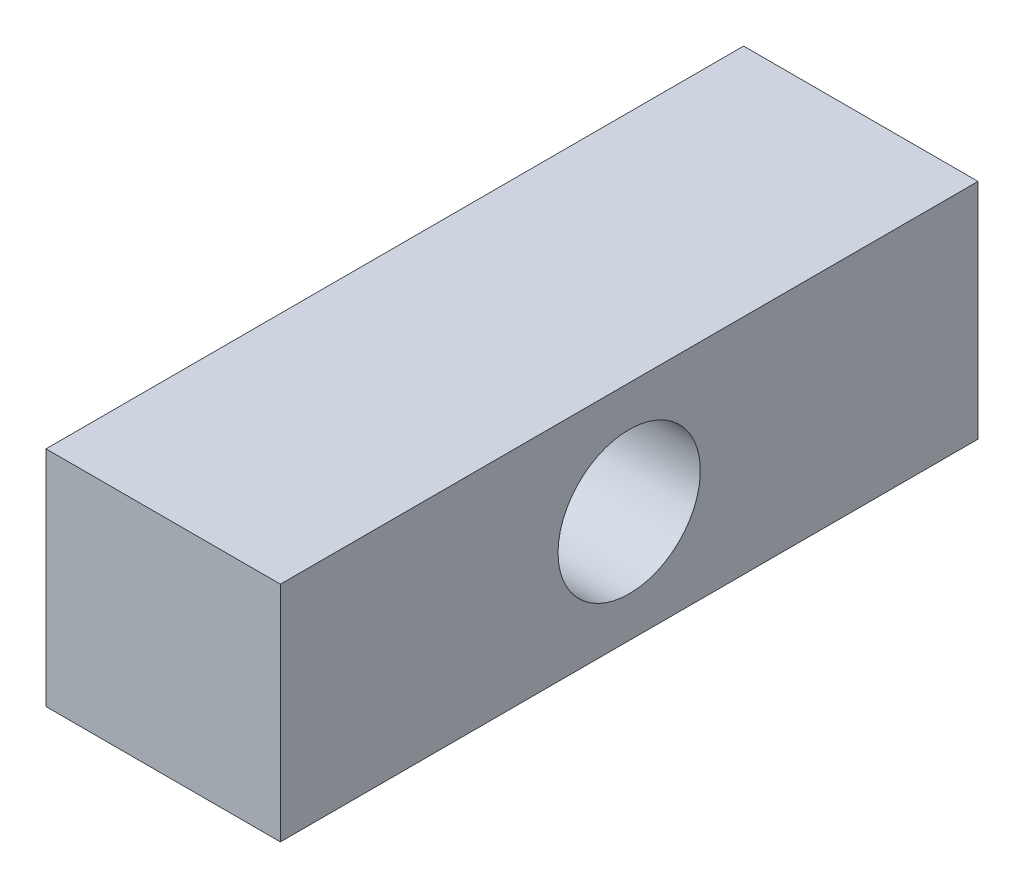
ISO-10303-21;
HEADER;
FILE_DESCRIPTION(('STEP AP214'),'2;1');
FILE_NAME('part.step','',(''),(''),'','','');
FILE_SCHEMA(('AUTOMOTIVE_DESIGN { 1 0 10303 214 1 1 1 1 }'));
ENDSEC;
DATA;
#1=APPLICATION_CONTEXT('core data for automotive mechanical design processes');
#2=APPLICATION_PROTOCOL_DEFINITION('international standard','automotive_design',2000,#1);
#3=PRODUCT_CONTEXT('',#1,'mechanical');
#4=PRODUCT('Part','Part','',(#3));
#5=PRODUCT_RELATED_PRODUCT_CATEGORY('part','',(#4));
#6=PRODUCT_DEFINITION_FORMATION('','',#4);
#7=PRODUCT_DEFINITION_CONTEXT('part definition',#1,'design');
#8=PRODUCT_DEFINITION('design','',#6,#7);
#9=PRODUCT_DEFINITION_SHAPE('','',#8);
#10=(LENGTH_UNIT() NAMED_UNIT(*) SI_UNIT(.MILLI.,.METRE.));
#11=(NAMED_UNIT(*) PLANE_ANGLE_UNIT() SI_UNIT($,.RADIAN.));
#12=(NAMED_UNIT(*) SI_UNIT($,.STERADIAN.) SOLID_ANGLE_UNIT());
#13=UNCERTAINTY_MEASURE_WITH_UNIT(LENGTH_MEASURE(1.E-05),#10,'distance_accuracy_value','');
#14=(GEOMETRIC_REPRESENTATION_CONTEXT(3) GLOBAL_UNCERTAINTY_ASSIGNED_CONTEXT((#13)) GLOBAL_UNIT_ASSIGNED_CONTEXT((#10,
#11,#12)) REPRESENTATION_CONTEXT('',''));
#15=CARTESIAN_POINT('',(0.,0.,0.));
#16=DIRECTION('',(0.,0.,1.));
#17=DIRECTION('',(1.,0.,0.));
#18=AXIS2_PLACEMENT_3D('',#15,#16,#17);
#19=CARTESIAN_POINT('',(168.,0.,0.));
#20=DIRECTION('',(-1.,0.,0.));
#21=DIRECTION('',(0.,0.,1.));
#22=AXIS2_PLACEMENT_3D('',#19,#20,#21);
#23=PLANE('',#22);
#24=DIRECTION('',(0.,1.,0.));
#25=VECTOR('',#24,1.);
#26=CARTESIAN_POINT('',(168.,-80.,-250.));
#27=LINE('',#26,#25);
#28=CARTESIAN_POINT('',(168.,-80.,-250.));
#29=VERTEX_POINT('',#28);
#30=CARTESIAN_POINT('',(168.,80.,-250.));
#31=VERTEX_POINT('',#30);
#32=EDGE_CURVE('E92',#29,#31,#27,.T.);
#33=ORIENTED_EDGE('',*,*,#32,.T.);
#34=DIRECTION('',(0.,0.,1.));
#35=VECTOR('',#34,1.);
#36=CARTESIAN_POINT('',(168.,80.,250.));
#37=LINE('',#36,#35);
#38=CARTESIAN_POINT('',(168.,80.,250.));
#39=VERTEX_POINT('',#38);
#40=EDGE_CURVE('E87',#31,#39,#37,.T.);
#41=ORIENTED_EDGE('',*,*,#40,.T.);
#42=DIRECTION('',(0.,-1.,0.));
#43=VECTOR('',#42,1.);
#44=CARTESIAN_POINT('',(168.,-80.,250.));
#45=LINE('',#44,#43);
#46=CARTESIAN_POINT('',(168.,-80.,250.));
#47=VERTEX_POINT('',#46);
#48=EDGE_CURVE('E90',#39,#47,#45,.T.);
#49=ORIENTED_EDGE('',*,*,#48,.T.);
#50=DIRECTION('',(0.,0.,-1.));
#51=VECTOR('',#50,1.);
#52=CARTESIAN_POINT('',(168.,-80.,250.));
#53=LINE('',#52,#51);
#54=EDGE_CURVE('E57',#47,#29,#53,.T.);
#55=ORIENTED_EDGE('',*,*,#54,.T.);
#56=EDGE_LOOP('',(#33,#41,#49,#55));
#57=FACE_BOUND('',#56,.T.);
#58=CARTESIAN_POINT('',(168.,0.,0.));
#59=DIRECTION('',(1.,0.,0.));
#60=DIRECTION('',(0.,0.,-1.));
#61=AXIS2_PLACEMENT_3D('',#58,#59,#60);
#62=CIRCLE('',#61,51.);
#63=CARTESIAN_POINT('',(168.,0.,51.));
#64=VERTEX_POINT('',#63);
#65=EDGE_CURVE('E112',#64,#64,#62,.T.);
#66=ORIENTED_EDGE('',*,*,#65,.F.);
#67=EDGE_LOOP('',(#66));
#68=FACE_BOUND('',#67,.T.);
#69=ADVANCED_FACE('F39',(#57,#68),#23,.F.);
#70=CARTESIAN_POINT('',(0.,0.,0.));
#71=DIRECTION('',(-1.,0.,0.));
#72=DIRECTION('',(0.,0.,1.));
#73=AXIS2_PLACEMENT_3D('',#70,#71,#72);
#74=PLANE('',#73);
#75=DIRECTION('',(0.,1.,0.));
#76=VECTOR('',#75,1.);
#77=CARTESIAN_POINT('',(0.,-80.,-250.));
#78=LINE('',#77,#76);
#79=CARTESIAN_POINT('',(0.,-80.,-250.));
#80=VERTEX_POINT('',#79);
#81=CARTESIAN_POINT('',(0.,80.,-250.));
#82=VERTEX_POINT('',#81);
#83=EDGE_CURVE('E108',#80,#82,#78,.T.);
#84=ORIENTED_EDGE('',*,*,#83,.F.);
#85=DIRECTION('',(0.,0.,-1.));
#86=VECTOR('',#85,1.);
#87=CARTESIAN_POINT('',(0.,-80.,250.));
#88=LINE('',#87,#86);
#89=CARTESIAN_POINT('',(0.,-80.,250.));
#90=VERTEX_POINT('',#89);
#91=EDGE_CURVE('E80',#90,#80,#88,.T.);
#92=ORIENTED_EDGE('',*,*,#91,.F.);
#93=DIRECTION('',(0.,-1.,0.));
#94=VECTOR('',#93,1.);
#95=CARTESIAN_POINT('',(0.,-80.,250.));
#96=LINE('',#95,#94);
#97=CARTESIAN_POINT('',(0.,80.,250.));
#98=VERTEX_POINT('',#97);
#99=EDGE_CURVE('E74',#98,#90,#96,.T.);
#100=ORIENTED_EDGE('',*,*,#99,.F.);
#101=DIRECTION('',(0.,0.,1.));
#102=VECTOR('',#101,1.);
#103=CARTESIAN_POINT('',(0.,80.,250.));
#104=LINE('',#103,#102);
#105=EDGE_CURVE('E97',#82,#98,#104,.T.);
#106=ORIENTED_EDGE('',*,*,#105,.F.);
#107=EDGE_LOOP('',(#84,#92,#100,#106));
#108=FACE_BOUND('',#107,.T.);
#109=CARTESIAN_POINT('',(0.,0.,0.));
#110=DIRECTION('',(1.,0.,0.));
#111=DIRECTION('',(0.,0.,-1.));
#112=AXIS2_PLACEMENT_3D('',#109,#110,#111);
#113=CIRCLE('',#112,51.);
#114=CARTESIAN_POINT('',(0.,0.,51.));
#115=VERTEX_POINT('',#114);
#116=EDGE_CURVE('E130',#115,#115,#113,.T.);
#117=ORIENTED_EDGE('',*,*,#116,.T.);
#118=EDGE_LOOP('',(#117));
#119=FACE_BOUND('',#118,.T.);
#120=ADVANCED_FACE('F125',(#108,#119),#74,.T.);
#121=CARTESIAN_POINT('',(168.,-80.,-250.));
#122=DIRECTION('',(0.,0.,1.));
#123=DIRECTION('',(1.,0.,0.));
#124=AXIS2_PLACEMENT_3D('',#121,#122,#123);
#125=PLANE('',#124);
#126=ORIENTED_EDGE('',*,*,#83,.T.);
#127=DIRECTION('',(-1.,0.,0.));
#128=VECTOR('',#127,1.);
#129=CARTESIAN_POINT('',(168.,80.,-250.));
#130=LINE('',#129,#128);
#131=EDGE_CURVE('E11',#31,#82,#130,.T.);
#132=ORIENTED_EDGE('',*,*,#131,.F.);
#133=ORIENTED_EDGE('',*,*,#32,.F.);
#134=DIRECTION('',(-1.,0.,0.));
#135=VECTOR('',#134,1.);
#136=CARTESIAN_POINT('',(168.,-80.,-250.));
#137=LINE('',#136,#135);
#138=EDGE_CURVE('E104',#29,#80,#137,.T.);
#139=ORIENTED_EDGE('',*,*,#138,.T.);
#140=EDGE_LOOP('',(#126,#132,#133,#139));
#141=FACE_BOUND('',#140,.T.);
#142=ADVANCED_FACE('F41',(#141),#125,.F.);
#143=CARTESIAN_POINT('',(168.,80.,250.));
#144=DIRECTION('',(0.,-1.,0.));
#145=DIRECTION('',(0.,0.,-1.));
#146=AXIS2_PLACEMENT_3D('',#143,#144,#145);
#147=PLANE('',#146);
#148=ORIENTED_EDGE('',*,*,#105,.T.);
#149=DIRECTION('',(-1.,0.,0.));
#150=VECTOR('',#149,1.);
#151=CARTESIAN_POINT('',(168.,80.,250.));
#152=LINE('',#151,#150);
#153=EDGE_CURVE('E49',#39,#98,#152,.T.);
#154=ORIENTED_EDGE('',*,*,#153,.F.);
#155=ORIENTED_EDGE('',*,*,#40,.F.);
#156=ORIENTED_EDGE('',*,*,#131,.T.);
#157=EDGE_LOOP('',(#148,#154,#155,#156));
#158=FACE_BOUND('',#157,.T.);
#159=ADVANCED_FACE('F96',(#158),#147,.F.);
#160=CARTESIAN_POINT('',(168.,-80.,250.));
#161=DIRECTION('',(0.,0.,-1.));
#162=DIRECTION('',(-1.,0.,0.));
#163=AXIS2_PLACEMENT_3D('',#160,#161,#162);
#164=PLANE('',#163);
#165=ORIENTED_EDGE('',*,*,#99,.T.);
#166=DIRECTION('',(-1.,0.,0.));
#167=VECTOR('',#166,1.);
#168=CARTESIAN_POINT('',(168.,-80.,250.));
#169=LINE('',#168,#167);
#170=EDGE_CURVE('E99',#47,#90,#169,.T.);
#171=ORIENTED_EDGE('',*,*,#170,.F.);
#172=ORIENTED_EDGE('',*,*,#48,.F.);
#173=ORIENTED_EDGE('',*,*,#153,.T.);
#174=EDGE_LOOP('',(#165,#171,#172,#173));
#175=FACE_BOUND('',#174,.T.);
#176=ADVANCED_FACE('F100',(#175),#164,.F.);
#177=CARTESIAN_POINT('',(168.,-80.,250.));
#178=DIRECTION('',(0.,1.,0.));
#179=DIRECTION('',(0.,0.,1.));
#180=AXIS2_PLACEMENT_3D('',#177,#178,#179);
#181=PLANE('',#180);
#182=ORIENTED_EDGE('',*,*,#91,.T.);
#183=ORIENTED_EDGE('',*,*,#138,.F.);
#184=ORIENTED_EDGE('',*,*,#54,.F.);
#185=ORIENTED_EDGE('',*,*,#170,.T.);
#186=EDGE_LOOP('',(#182,#183,#184,#185));
#187=FACE_BOUND('',#186,.T.);
#188=ADVANCED_FACE('F122',(#187),#181,.F.);
#189=CARTESIAN_POINT('',(168.,0.,0.));
#190=DIRECTION('',(-1.,0.,0.));
#191=DIRECTION('',(0.,0.,1.));
#192=AXIS2_PLACEMENT_3D('',#189,#190,#191);
#193=CYLINDRICAL_SURFACE('',#192,51.);
#194=CARTESIAN_POINT('',(168.,0.,51.));
#195=CARTESIAN_POINT('',(166.25,0.,51.));
#196=CARTESIAN_POINT('',(164.5,0.,51.));
#197=CARTESIAN_POINT('',(161.,0.,51.));
#198=CARTESIAN_POINT('',(159.25,0.,51.));
#199=CARTESIAN_POINT('',(155.75,0.,51.));
#200=CARTESIAN_POINT('',(154.,0.,51.));
#201=CARTESIAN_POINT('',(150.5,0.,51.));
#202=CARTESIAN_POINT('',(148.75,0.,51.));
#203=CARTESIAN_POINT('',(145.25,0.,51.));
#204=CARTESIAN_POINT('',(143.5,0.,51.));
#205=CARTESIAN_POINT('',(140.,0.,51.));
#206=CARTESIAN_POINT('',(138.25,0.,51.));
#207=CARTESIAN_POINT('',(134.75,0.,51.));
#208=CARTESIAN_POINT('',(133.,0.,51.));
#209=CARTESIAN_POINT('',(129.5,0.,51.));
#210=CARTESIAN_POINT('',(127.75,0.,51.));
#211=CARTESIAN_POINT('',(124.25,0.,51.));
#212=CARTESIAN_POINT('',(122.5,0.,51.));
#213=CARTESIAN_POINT('',(119.,0.,51.));
#214=CARTESIAN_POINT('',(117.25,0.,51.));
#215=CARTESIAN_POINT('',(113.75,0.,51.));
#216=CARTESIAN_POINT('',(112.,0.,51.));
#217=CARTESIAN_POINT('',(108.5,0.,51.));
#218=CARTESIAN_POINT('',(106.75,0.,51.));
#219=CARTESIAN_POINT('',(103.25,0.,51.));
#220=CARTESIAN_POINT('',(101.5,0.,51.));
#221=CARTESIAN_POINT('',(98.,0.,51.));
#222=CARTESIAN_POINT('',(96.25,0.,51.));
#223=CARTESIAN_POINT('',(92.75,0.,51.));
#224=CARTESIAN_POINT('',(91.,0.,51.));
#225=CARTESIAN_POINT('',(87.5,0.,51.));
#226=CARTESIAN_POINT('',(85.75,0.,51.));
#227=CARTESIAN_POINT('',(82.25,0.,51.));
#228=CARTESIAN_POINT('',(80.5,0.,51.));
#229=CARTESIAN_POINT('',(77.,0.,51.));
#230=CARTESIAN_POINT('',(75.25,0.,51.));
#231=CARTESIAN_POINT('',(71.75,0.,51.));
#232=CARTESIAN_POINT('',(70.,0.,51.));
#233=CARTESIAN_POINT('',(66.5,0.,51.));
#234=CARTESIAN_POINT('',(64.75,0.,51.));
#235=CARTESIAN_POINT('',(61.25,0.,51.));
#236=CARTESIAN_POINT('',(59.5,0.,51.));
#237=CARTESIAN_POINT('',(56.,0.,51.));
#238=CARTESIAN_POINT('',(54.25,0.,51.));
#239=CARTESIAN_POINT('',(50.75,0.,51.));
#240=CARTESIAN_POINT('',(49.,0.,51.));
#241=CARTESIAN_POINT('',(45.5,0.,51.));
#242=CARTESIAN_POINT('',(43.75,0.,51.));
#243=CARTESIAN_POINT('',(40.25,0.,51.));
#244=CARTESIAN_POINT('',(38.5,0.,51.));
#245=CARTESIAN_POINT('',(35.,0.,51.));
#246=CARTESIAN_POINT('',(33.25,0.,51.));
#247=CARTESIAN_POINT('',(29.75,0.,51.));
#248=CARTESIAN_POINT('',(28.,0.,51.));
#249=CARTESIAN_POINT('',(24.5,0.,51.));
#250=CARTESIAN_POINT('',(22.75,0.,51.));
#251=CARTESIAN_POINT('',(19.25,0.,51.));
#252=CARTESIAN_POINT('',(17.5,0.,51.));
#253=CARTESIAN_POINT('',(14.,0.,51.));
#254=CARTESIAN_POINT('',(12.25,0.,51.));
#255=CARTESIAN_POINT('',(8.75000000000001,0.,51.));
#256=CARTESIAN_POINT('',(7.00000000000001,0.,51.));
#257=CARTESIAN_POINT('',(3.5,0.,51.));
#258=CARTESIAN_POINT('',(1.75,0.,51.));
#259=CARTESIAN_POINT('',(0.,0.,51.));
#260=B_SPLINE_CURVE_WITH_KNOTS('',3,(#194,#195,#196,#197,#198,#199,#200,#201,#202,#203,#204,
#205,#206,#207,#208,#209,#210,#211,#212,#213,#214,#215,#216,#217,#218,#219,#220,#221,#222,#223,
#224,#225,#226,#227,#228,#229,#230,#231,#232,#233,#234,#235,#236,#237,#238,#239,#240,#241,#242,
#243,#244,#245,#246,#247,#248,#249,#250,#251,#252,#253,#254,#255,#256,#257,#258,#259),
.UNSPECIFIED.,.F.,.F.,(4,2,2,2,2,2,2,2,2,2,2,2,2,2,2,2,2,2,2,2,2,2,2,2,2,2,2,2,2,2,2,2,4),(0.,
5.24999999999998,10.5,15.75,21.,26.25,31.5,36.75,42.,47.25,52.5,57.75,63.,68.25,73.5,78.75,84.,
89.25,94.5,99.75,105.,110.25,115.5,120.75,126.,131.25,136.5,141.75,147.,152.25,157.5,162.75,
168.),.UNSPECIFIED.);
#261=EDGE_CURVE('BSEAM138',#64,#115,#260,.T.);
#262=ORIENTED_EDGE('',*,*,#65,.T.);
#263=ORIENTED_EDGE('',*,*,#116,.F.);
#264=ORIENTED_EDGE('',*,*,#261,.T.);
#265=ORIENTED_EDGE('',*,*,#261,.F.);
#266=EDGE_LOOP('',(#262,#264,#263,#265));
#267=FACE_BOUND('',#266,.T.);
#268=ADVANCED_FACE('F138',(#267),#193,.F.);
#269=CLOSED_SHELL('',(#69,#120,#142,#159,#176,#188,#268));
#270=MANIFOLD_SOLID_BREP('B2',#269);
#271=ADVANCED_BREP_SHAPE_REPRESENTATION('',(#18,#270),#14);
#272=SHAPE_DEFINITION_REPRESENTATION(#9,#271);
ENDSEC;
END-ISO-10303-21;
